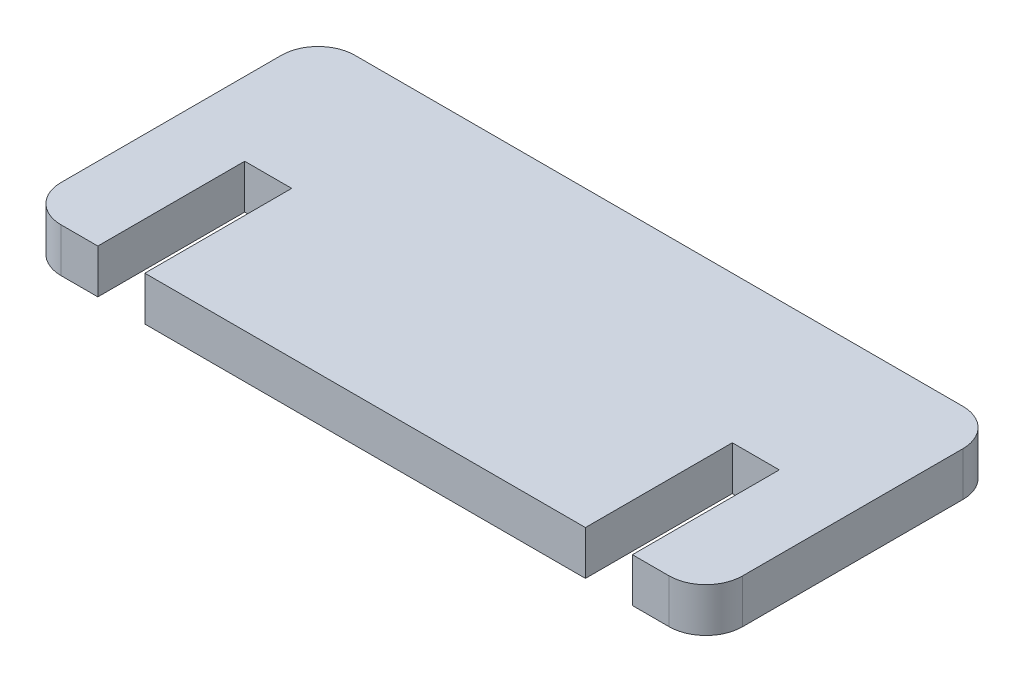
ISO-10303-21;
HEADER;
FILE_DESCRIPTION(('STEP AP214'),'2;1');
FILE_NAME('part.step','',(''),(''),'','','');
FILE_SCHEMA(('AUTOMOTIVE_DESIGN { 1 0 10303 214 1 1 1 1 }'));
ENDSEC;
DATA;
#1=APPLICATION_CONTEXT('core data for automotive mechanical design processes');
#2=APPLICATION_PROTOCOL_DEFINITION('international standard','automotive_design',2000,#1);
#3=PRODUCT_CONTEXT('',#1,'mechanical');
#4=PRODUCT('Part','Part','',(#3));
#5=PRODUCT_RELATED_PRODUCT_CATEGORY('part','',(#4));
#6=PRODUCT_DEFINITION_FORMATION('','',#4);
#7=PRODUCT_DEFINITION_CONTEXT('part definition',#1,'design');
#8=PRODUCT_DEFINITION('design','',#6,#7);
#9=PRODUCT_DEFINITION_SHAPE('','',#8);
#10=(LENGTH_UNIT() NAMED_UNIT(*) SI_UNIT(.MILLI.,.METRE.));
#11=(NAMED_UNIT(*) PLANE_ANGLE_UNIT() SI_UNIT($,.RADIAN.));
#12=(NAMED_UNIT(*) SI_UNIT($,.STERADIAN.) SOLID_ANGLE_UNIT());
#13=UNCERTAINTY_MEASURE_WITH_UNIT(LENGTH_MEASURE(1.E-05),#10,'distance_accuracy_value','');
#14=(GEOMETRIC_REPRESENTATION_CONTEXT(3) GLOBAL_UNCERTAINTY_ASSIGNED_CONTEXT((#13)) GLOBAL_UNIT_ASSIGNED_CONTEXT((#10,
#11,#12)) REPRESENTATION_CONTEXT('',''));
#15=CARTESIAN_POINT('',(0.,0.,0.));
#16=DIRECTION('',(0.,0.,1.));
#17=DIRECTION('',(1.,0.,0.));
#18=AXIS2_PLACEMENT_3D('',#15,#16,#17);
#19=CARTESIAN_POINT('',(15.,3.,0.));
#20=DIRECTION('',(-1.,0.,0.));
#21=DIRECTION('',(0.,0.,1.));
#22=AXIS2_PLACEMENT_3D('',#19,#20,#21);
#23=PLANE('',#22);
#24=DIRECTION('',(0.,0.,-1.));
#25=VECTOR('',#24,1.);
#26=CARTESIAN_POINT('',(15.,0.,0.));
#27=LINE('',#26,#25);
#28=CARTESIAN_POINT('',(15.,0.,10.));
#29=VERTEX_POINT('',#28);
#30=CARTESIAN_POINT('',(15.,0.,0.));
#31=VERTEX_POINT('',#30);
#32=EDGE_CURVE('E188',#29,#31,#27,.T.);
#33=ORIENTED_EDGE('',*,*,#32,.T.);
#34=DIRECTION('',(0.,-1.,0.));
#35=VECTOR('',#34,1.);
#36=CARTESIAN_POINT('',(15.,3.,0.));
#37=LINE('',#36,#35);
#38=CARTESIAN_POINT('',(15.,3.,0.));
#39=VERTEX_POINT('',#38);
#40=EDGE_CURVE('E11',#39,#31,#37,.T.);
#41=ORIENTED_EDGE('',*,*,#40,.F.);
#42=DIRECTION('',(0.,0.,-1.));
#43=VECTOR('',#42,1.);
#44=CARTESIAN_POINT('',(15.,3.,0.));
#45=LINE('',#44,#43);
#46=CARTESIAN_POINT('',(15.,3.,10.));
#47=VERTEX_POINT('',#46);
#48=EDGE_CURVE('E235',#47,#39,#45,.T.);
#49=ORIENTED_EDGE('',*,*,#48,.F.);
#50=DIRECTION('',(0.,-1.,0.));
#51=VECTOR('',#50,1.);
#52=CARTESIAN_POINT('',(15.,3.,10.));
#53=LINE('',#52,#51);
#54=EDGE_CURVE('E184',#47,#29,#53,.T.);
#55=ORIENTED_EDGE('',*,*,#54,.T.);
#56=EDGE_LOOP('',(#33,#41,#49,#55));
#57=FACE_BOUND('',#56,.T.);
#58=ADVANCED_FACE('F39',(#57),#23,.F.);
#59=CARTESIAN_POINT('',(18.2,3.,0.));
#60=DIRECTION('',(0.,0.,-1.));
#61=DIRECTION('',(-1.,0.,0.));
#62=AXIS2_PLACEMENT_3D('',#59,#60,#61);
#63=PLANE('',#62);
#64=DIRECTION('',(1.,0.,0.));
#65=VECTOR('',#64,1.);
#66=CARTESIAN_POINT('',(18.2,0.,0.));
#67=LINE('',#66,#65);
#68=CARTESIAN_POINT('',(18.2,0.,0.));
#69=VERTEX_POINT('',#68);
#70=EDGE_CURVE('E192',#31,#69,#67,.T.);
#71=ORIENTED_EDGE('',*,*,#70,.T.);
#72=DIRECTION('',(0.,-1.,0.));
#73=VECTOR('',#72,1.);
#74=CARTESIAN_POINT('',(18.2,3.,0.));
#75=LINE('',#74,#73);
#76=CARTESIAN_POINT('',(18.2,3.,0.));
#77=VERTEX_POINT('',#76);
#78=EDGE_CURVE('E48',#77,#69,#75,.T.);
#79=ORIENTED_EDGE('',*,*,#78,.F.);
#80=DIRECTION('',(1.,0.,0.));
#81=VECTOR('',#80,1.);
#82=CARTESIAN_POINT('',(18.2,3.,0.));
#83=LINE('',#82,#81);
#84=EDGE_CURVE('E123',#39,#77,#83,.T.);
#85=ORIENTED_EDGE('',*,*,#84,.F.);
#86=ORIENTED_EDGE('',*,*,#40,.T.);
#87=EDGE_LOOP('',(#71,#79,#85,#86));
#88=FACE_BOUND('',#87,.T.);
#89=ADVANCED_FACE('F357',(#88),#63,.F.);
#90=CARTESIAN_POINT('',(18.2,3.,10.));
#91=DIRECTION('',(1.,0.,0.));
#92=DIRECTION('',(0.,0.,-1.));
#93=AXIS2_PLACEMENT_3D('',#90,#91,#92);
#94=PLANE('',#93);
#95=DIRECTION('',(0.,0.,1.));
#96=VECTOR('',#95,1.);
#97=CARTESIAN_POINT('',(18.2,0.,10.));
#98=LINE('',#97,#96);
#99=CARTESIAN_POINT('',(18.2,0.,10.));
#100=VERTEX_POINT('',#99);
#101=EDGE_CURVE('E195',#69,#100,#98,.T.);
#102=ORIENTED_EDGE('',*,*,#101,.T.);
#103=DIRECTION('',(0.,-1.,0.));
#104=VECTOR('',#103,1.);
#105=CARTESIAN_POINT('',(18.2,3.,10.));
#106=LINE('',#105,#104);
#107=CARTESIAN_POINT('',(18.2,3.,10.));
#108=VERTEX_POINT('',#107);
#109=EDGE_CURVE('E278',#108,#100,#106,.T.);
#110=ORIENTED_EDGE('',*,*,#109,.F.);
#111=DIRECTION('',(0.,0.,1.));
#112=VECTOR('',#111,1.);
#113=CARTESIAN_POINT('',(18.2,3.,10.));
#114=LINE('',#113,#112);
#115=EDGE_CURVE('E288',#77,#108,#114,.T.);
#116=ORIENTED_EDGE('',*,*,#115,.F.);
#117=ORIENTED_EDGE('',*,*,#78,.T.);
#118=EDGE_LOOP('',(#102,#110,#116,#117));
#119=FACE_BOUND('',#118,.T.);
#120=ADVANCED_FACE('F286',(#119),#94,.F.);
#121=CARTESIAN_POINT('',(20.7,3.,10.));
#122=DIRECTION('',(0.,0.,-1.));
#123=DIRECTION('',(-1.,0.,0.));
#124=AXIS2_PLACEMENT_3D('',#121,#122,#123);
#125=PLANE('',#124);
#126=DIRECTION('',(1.,0.,0.));
#127=VECTOR('',#126,1.);
#128=CARTESIAN_POINT('',(20.7,0.,10.));
#129=LINE('',#128,#127);
#130=CARTESIAN_POINT('',(20.7,0.,10.));
#131=VERTEX_POINT('',#130);
#132=EDGE_CURVE('E198',#100,#131,#129,.T.);
#133=ORIENTED_EDGE('',*,*,#132,.T.);
#134=DIRECTION('',(0.,-1.,0.));
#135=VECTOR('',#134,1.);
#136=CARTESIAN_POINT('',(20.7,3.,10.));
#137=LINE('',#136,#135);
#138=CARTESIAN_POINT('',(20.7,3.,10.));
#139=VERTEX_POINT('',#138);
#140=EDGE_CURVE('E274',#139,#131,#137,.T.);
#141=ORIENTED_EDGE('',*,*,#140,.F.);
#142=DIRECTION('',(1.,0.,0.));
#143=VECTOR('',#142,1.);
#144=CARTESIAN_POINT('',(20.7,3.,10.));
#145=LINE('',#144,#143);
#146=EDGE_CURVE('E307',#108,#139,#145,.T.);
#147=ORIENTED_EDGE('',*,*,#146,.F.);
#148=ORIENTED_EDGE('',*,*,#109,.T.);
#149=EDGE_LOOP('',(#133,#141,#147,#148));
#150=FACE_BOUND('',#149,.T.);
#151=ADVANCED_FACE('F297',(#150),#125,.F.);
#152=CARTESIAN_POINT('',(20.7,3.,7.5));
#153=DIRECTION('',(0.,-1.,0.));
#154=DIRECTION('',(0.,0.,-1.));
#155=AXIS2_PLACEMENT_3D('',#152,#153,#154);
#156=CYLINDRICAL_SURFACE('',#155,2.5);
#157=CARTESIAN_POINT('',(20.7,0.,7.5));
#158=DIRECTION('',(0.,1.,0.));
#159=DIRECTION('',(0.,0.,-1.));
#160=AXIS2_PLACEMENT_3D('',#157,#158,#159);
#161=CIRCLE('',#160,2.5);
#162=CARTESIAN_POINT('',(23.2,0.,7.5));
#163=VERTEX_POINT('',#162);
#164=EDGE_CURVE('E201',#131,#163,#161,.T.);
#165=ORIENTED_EDGE('',*,*,#164,.T.);
#166=DIRECTION('',(0.,-1.,0.));
#167=VECTOR('',#166,1.);
#168=CARTESIAN_POINT('',(23.2,3.,7.5));
#169=LINE('',#168,#167);
#170=CARTESIAN_POINT('',(23.2,3.,7.5));
#171=VERTEX_POINT('',#170);
#172=EDGE_CURVE('E270',#171,#163,#169,.T.);
#173=ORIENTED_EDGE('',*,*,#172,.F.);
#174=CARTESIAN_POINT('',(20.7,3.,7.5));
#175=DIRECTION('',(0.,1.,0.));
#176=DIRECTION('',(0.,0.,-1.));
#177=AXIS2_PLACEMENT_3D('',#174,#175,#176);
#178=CIRCLE('',#177,2.5);
#179=EDGE_CURVE('E303',#139,#171,#178,.T.);
#180=ORIENTED_EDGE('',*,*,#179,.F.);
#181=ORIENTED_EDGE('',*,*,#140,.T.);
#182=EDGE_LOOP('',(#165,#173,#180,#181));
#183=FACE_BOUND('',#182,.T.);
#184=ADVANCED_FACE('F301',(#183),#156,.T.);
#185=CARTESIAN_POINT('',(23.2,3.,-7.5));
#186=DIRECTION('',(-1.,0.,0.));
#187=DIRECTION('',(0.,0.,1.));
#188=AXIS2_PLACEMENT_3D('',#185,#186,#187);
#189=PLANE('',#188);
#190=DIRECTION('',(0.,0.,-1.));
#191=VECTOR('',#190,1.);
#192=CARTESIAN_POINT('',(23.2,0.,-7.5));
#193=LINE('',#192,#191);
#194=CARTESIAN_POINT('',(23.2,0.,-7.5));
#195=VERTEX_POINT('',#194);
#196=EDGE_CURVE('E204',#163,#195,#193,.T.);
#197=ORIENTED_EDGE('',*,*,#196,.T.);
#198=DIRECTION('',(0.,-1.,0.));
#199=VECTOR('',#198,1.);
#200=CARTESIAN_POINT('',(23.2,3.,-7.5));
#201=LINE('',#200,#199);
#202=CARTESIAN_POINT('',(23.2,3.,-7.5));
#203=VERTEX_POINT('',#202);
#204=EDGE_CURVE('E266',#203,#195,#201,.T.);
#205=ORIENTED_EDGE('',*,*,#204,.F.);
#206=DIRECTION('',(0.,0.,-1.));
#207=VECTOR('',#206,1.);
#208=CARTESIAN_POINT('',(23.2,3.,-7.5));
#209=LINE('',#208,#207);
#210=EDGE_CURVE('E306',#171,#203,#209,.T.);
#211=ORIENTED_EDGE('',*,*,#210,.F.);
#212=ORIENTED_EDGE('',*,*,#172,.T.);
#213=EDGE_LOOP('',(#197,#205,#211,#212));
#214=FACE_BOUND('',#213,.T.);
#215=ADVANCED_FACE('F370',(#214),#189,.F.);
#216=CARTESIAN_POINT('',(20.7,3.,-7.5));
#217=DIRECTION('',(0.,-1.,0.));
#218=DIRECTION('',(0.,0.,-1.));
#219=AXIS2_PLACEMENT_3D('',#216,#217,#218);
#220=CYLINDRICAL_SURFACE('',#219,2.5);
#221=CARTESIAN_POINT('',(20.7,0.,-7.5));
#222=DIRECTION('',(0.,1.,0.));
#223=DIRECTION('',(0.,0.,-1.));
#224=AXIS2_PLACEMENT_3D('',#221,#222,#223);
#225=CIRCLE('',#224,2.5);
#226=CARTESIAN_POINT('',(20.7,0.,-10.));
#227=VERTEX_POINT('',#226);
#228=EDGE_CURVE('E207',#195,#227,#225,.T.);
#229=ORIENTED_EDGE('',*,*,#228,.T.);
#230=DIRECTION('',(0.,-1.,0.));
#231=VECTOR('',#230,1.);
#232=CARTESIAN_POINT('',(20.7,3.,-10.));
#233=LINE('',#232,#231);
#234=CARTESIAN_POINT('',(20.7,3.,-10.));
#235=VERTEX_POINT('',#234);
#236=EDGE_CURVE('E262',#235,#227,#233,.T.);
#237=ORIENTED_EDGE('',*,*,#236,.F.);
#238=CARTESIAN_POINT('',(20.7,3.,-7.5));
#239=DIRECTION('',(0.,1.,0.));
#240=DIRECTION('',(0.,0.,-1.));
#241=AXIS2_PLACEMENT_3D('',#238,#239,#240);
#242=CIRCLE('',#241,2.5);
#243=EDGE_CURVE('E311',#203,#235,#242,.T.);
#244=ORIENTED_EDGE('',*,*,#243,.F.);
#245=ORIENTED_EDGE('',*,*,#204,.T.);
#246=EDGE_LOOP('',(#229,#237,#244,#245));
#247=FACE_BOUND('',#246,.T.);
#248=ADVANCED_FACE('F373',(#247),#220,.T.);
#249=CARTESIAN_POINT('',(-15.,3.,-10.));
#250=DIRECTION('',(0.,0.,1.));
#251=DIRECTION('',(1.,0.,0.));
#252=AXIS2_PLACEMENT_3D('',#249,#250,#251);
#253=PLANE('',#252);
#254=DIRECTION('',(-1.,0.,0.));
#255=VECTOR('',#254,1.);
#256=CARTESIAN_POINT('',(-15.,0.,-10.));
#257=LINE('',#256,#255);
#258=CARTESIAN_POINT('',(-20.7,0.,-10.));
#259=VERTEX_POINT('',#258);
#260=EDGE_CURVE('E211',#227,#259,#257,.T.);
#261=ORIENTED_EDGE('',*,*,#260,.T.);
#262=DIRECTION('',(0.,-1.,0.));
#263=VECTOR('',#262,1.);
#264=CARTESIAN_POINT('',(-20.7,3.,-10.));
#265=LINE('',#264,#263);
#266=CARTESIAN_POINT('',(-20.7,3.,-10.));
#267=VERTEX_POINT('',#266);
#268=EDGE_CURVE('E258',#267,#259,#265,.T.);
#269=ORIENTED_EDGE('',*,*,#268,.F.);
#270=DIRECTION('',(-1.,0.,0.));
#271=VECTOR('',#270,1.);
#272=CARTESIAN_POINT('',(15.,3.,-10.));
#273=LINE('',#272,#271);
#274=EDGE_CURVE('E318',#235,#267,#273,.T.);
#275=ORIENTED_EDGE('',*,*,#274,.F.);
#276=ORIENTED_EDGE('',*,*,#236,.T.);
#277=EDGE_LOOP('',(#261,#269,#275,#276));
#278=FACE_BOUND('',#277,.T.);
#279=ADVANCED_FACE('F377',(#278),#253,.F.);
#280=CARTESIAN_POINT('',(-20.7,3.,-7.5));
#281=DIRECTION('',(0.,-1.,0.));
#282=DIRECTION('',(0.,0.,-1.));
#283=AXIS2_PLACEMENT_3D('',#280,#281,#282);
#284=CYLINDRICAL_SURFACE('',#283,2.5);
#285=CARTESIAN_POINT('',(-20.7,0.,-7.5));
#286=DIRECTION('',(0.,1.,0.));
#287=DIRECTION('',(0.,0.,1.));
#288=AXIS2_PLACEMENT_3D('',#285,#286,#287);
#289=CIRCLE('',#288,2.5);
#290=CARTESIAN_POINT('',(-23.2,0.,-7.5));
#291=VERTEX_POINT('',#290);
#292=EDGE_CURVE('E214',#259,#291,#289,.T.);
#293=ORIENTED_EDGE('',*,*,#292,.T.);
#294=DIRECTION('',(0.,-1.,0.));
#295=VECTOR('',#294,1.);
#296=CARTESIAN_POINT('',(-23.2,3.,-7.5));
#297=LINE('',#296,#295);
#298=CARTESIAN_POINT('',(-23.2,3.,-7.5));
#299=VERTEX_POINT('',#298);
#300=EDGE_CURVE('E254',#299,#291,#297,.T.);
#301=ORIENTED_EDGE('',*,*,#300,.F.);
#302=CARTESIAN_POINT('',(-20.7,3.,-7.5));
#303=DIRECTION('',(0.,1.,0.));
#304=DIRECTION('',(0.,0.,1.));
#305=AXIS2_PLACEMENT_3D('',#302,#303,#304);
#306=CIRCLE('',#305,2.5);
#307=EDGE_CURVE('E321',#267,#299,#306,.T.);
#308=ORIENTED_EDGE('',*,*,#307,.F.);
#309=ORIENTED_EDGE('',*,*,#268,.T.);
#310=EDGE_LOOP('',(#293,#301,#308,#309));
#311=FACE_BOUND('',#310,.T.);
#312=ADVANCED_FACE('F381',(#311),#284,.T.);
#313=CARTESIAN_POINT('',(-23.2,3.,-7.5));
#314=DIRECTION('',(1.,0.,0.));
#315=DIRECTION('',(0.,0.,-1.));
#316=AXIS2_PLACEMENT_3D('',#313,#314,#315);
#317=PLANE('',#316);
#318=DIRECTION('',(0.,0.,1.));
#319=VECTOR('',#318,1.);
#320=CARTESIAN_POINT('',(-23.2,0.,-7.5));
#321=LINE('',#320,#319);
#322=CARTESIAN_POINT('',(-23.2,0.,7.5));
#323=VERTEX_POINT('',#322);
#324=EDGE_CURVE('E217',#291,#323,#321,.T.);
#325=ORIENTED_EDGE('',*,*,#324,.T.);
#326=DIRECTION('',(0.,-1.,0.));
#327=VECTOR('',#326,1.);
#328=CARTESIAN_POINT('',(-23.2,3.,7.5));
#329=LINE('',#328,#327);
#330=CARTESIAN_POINT('',(-23.2,3.,7.5));
#331=VERTEX_POINT('',#330);
#332=EDGE_CURVE('E250',#331,#323,#329,.T.);
#333=ORIENTED_EDGE('',*,*,#332,.F.);
#334=DIRECTION('',(0.,0.,1.));
#335=VECTOR('',#334,1.);
#336=CARTESIAN_POINT('',(-23.2,3.,-7.5));
#337=LINE('',#336,#335);
#338=EDGE_CURVE('E324',#299,#331,#337,.T.);
#339=ORIENTED_EDGE('',*,*,#338,.F.);
#340=ORIENTED_EDGE('',*,*,#300,.T.);
#341=EDGE_LOOP('',(#325,#333,#339,#340));
#342=FACE_BOUND('',#341,.T.);
#343=ADVANCED_FACE('F385',(#342),#317,.F.);
#344=CARTESIAN_POINT('',(-20.7,3.,7.5));
#345=DIRECTION('',(0.,-1.,0.));
#346=DIRECTION('',(0.,0.,-1.));
#347=AXIS2_PLACEMENT_3D('',#344,#345,#346);
#348=CYLINDRICAL_SURFACE('',#347,2.5);
#349=CARTESIAN_POINT('',(-20.7,0.,7.5));
#350=DIRECTION('',(0.,1.,0.));
#351=DIRECTION('',(0.,0.,1.));
#352=AXIS2_PLACEMENT_3D('',#349,#350,#351);
#353=CIRCLE('',#352,2.5);
#354=CARTESIAN_POINT('',(-20.7,0.,10.));
#355=VERTEX_POINT('',#354);
#356=EDGE_CURVE('E220',#323,#355,#353,.T.);
#357=ORIENTED_EDGE('',*,*,#356,.T.);
#358=DIRECTION('',(0.,-1.,0.));
#359=VECTOR('',#358,1.);
#360=CARTESIAN_POINT('',(-20.7,3.,10.));
#361=LINE('',#360,#359);
#362=CARTESIAN_POINT('',(-20.7,3.,10.));
#363=VERTEX_POINT('',#362);
#364=EDGE_CURVE('E246',#363,#355,#361,.T.);
#365=ORIENTED_EDGE('',*,*,#364,.F.);
#366=CARTESIAN_POINT('',(-20.7,3.,7.5));
#367=DIRECTION('',(0.,1.,0.));
#368=DIRECTION('',(0.,0.,1.));
#369=AXIS2_PLACEMENT_3D('',#366,#367,#368);
#370=CIRCLE('',#369,2.5);
#371=EDGE_CURVE('E327',#331,#363,#370,.T.);
#372=ORIENTED_EDGE('',*,*,#371,.F.);
#373=ORIENTED_EDGE('',*,*,#332,.T.);
#374=EDGE_LOOP('',(#357,#365,#372,#373));
#375=FACE_BOUND('',#374,.T.);
#376=ADVANCED_FACE('F389',(#375),#348,.T.);
#377=CARTESIAN_POINT('',(-20.7,3.,10.));
#378=DIRECTION('',(0.,0.,-1.));
#379=DIRECTION('',(-1.,0.,0.));
#380=AXIS2_PLACEMENT_3D('',#377,#378,#379);
#381=PLANE('',#380);
#382=DIRECTION('',(1.,0.,0.));
#383=VECTOR('',#382,1.);
#384=CARTESIAN_POINT('',(-20.7,0.,10.));
#385=LINE('',#384,#383);
#386=CARTESIAN_POINT('',(-18.2,0.,10.));
#387=VERTEX_POINT('',#386);
#388=EDGE_CURVE('E223',#355,#387,#385,.T.);
#389=ORIENTED_EDGE('',*,*,#388,.T.);
#390=DIRECTION('',(0.,-1.,0.));
#391=VECTOR('',#390,1.);
#392=CARTESIAN_POINT('',(-18.2,3.,10.));
#393=LINE('',#392,#391);
#394=CARTESIAN_POINT('',(-18.2,3.,10.));
#395=VERTEX_POINT('',#394);
#396=EDGE_CURVE('E242',#395,#387,#393,.T.);
#397=ORIENTED_EDGE('',*,*,#396,.F.);
#398=DIRECTION('',(1.,0.,0.));
#399=VECTOR('',#398,1.);
#400=CARTESIAN_POINT('',(-20.7,3.,10.));
#401=LINE('',#400,#399);
#402=EDGE_CURVE('E330',#363,#395,#401,.T.);
#403=ORIENTED_EDGE('',*,*,#402,.F.);
#404=ORIENTED_EDGE('',*,*,#364,.T.);
#405=EDGE_LOOP('',(#389,#397,#403,#404));
#406=FACE_BOUND('',#405,.T.);
#407=ADVANCED_FACE('F338',(#406),#381,.F.);
#408=CARTESIAN_POINT('',(-18.2,3.,10.));
#409=DIRECTION('',(-1.,0.,0.));
#410=DIRECTION('',(0.,0.,1.));
#411=AXIS2_PLACEMENT_3D('',#408,#409,#410);
#412=PLANE('',#411);
#413=DIRECTION('',(0.,0.,-1.));
#414=VECTOR('',#413,1.);
#415=CARTESIAN_POINT('',(-18.2,0.,10.));
#416=LINE('',#415,#414);
#417=CARTESIAN_POINT('',(-18.2,0.,0.));
#418=VERTEX_POINT('',#417);
#419=EDGE_CURVE('E226',#387,#418,#416,.T.);
#420=ORIENTED_EDGE('',*,*,#419,.T.);
#421=DIRECTION('',(0.,-1.,0.));
#422=VECTOR('',#421,1.);
#423=CARTESIAN_POINT('',(-18.2,3.,0.));
#424=LINE('',#423,#422);
#425=CARTESIAN_POINT('',(-18.2,3.,0.));
#426=VERTEX_POINT('',#425);
#427=EDGE_CURVE('E177',#426,#418,#424,.T.);
#428=ORIENTED_EDGE('',*,*,#427,.F.);
#429=DIRECTION('',(0.,0.,-1.));
#430=VECTOR('',#429,1.);
#431=CARTESIAN_POINT('',(-18.2,3.,10.));
#432=LINE('',#431,#430);
#433=EDGE_CURVE('E166',#395,#426,#432,.T.);
#434=ORIENTED_EDGE('',*,*,#433,.F.);
#435=ORIENTED_EDGE('',*,*,#396,.T.);
#436=EDGE_LOOP('',(#420,#428,#434,#435));
#437=FACE_BOUND('',#436,.T.);
#438=ADVANCED_FACE('F342',(#437),#412,.F.);
#439=CARTESIAN_POINT('',(-18.2,3.,0.));
#440=DIRECTION('',(0.,0.,-1.));
#441=DIRECTION('',(-1.,0.,0.));
#442=AXIS2_PLACEMENT_3D('',#439,#440,#441);
#443=PLANE('',#442);
#444=DIRECTION('',(1.,0.,0.));
#445=VECTOR('',#444,1.);
#446=CARTESIAN_POINT('',(-18.2,0.,0.));
#447=LINE('',#446,#445);
#448=CARTESIAN_POINT('',(-15.,0.,0.));
#449=VERTEX_POINT('',#448);
#450=EDGE_CURVE('E175',#418,#449,#447,.T.);
#451=ORIENTED_EDGE('',*,*,#450,.T.);
#452=DIRECTION('',(0.,-1.,0.));
#453=VECTOR('',#452,1.);
#454=CARTESIAN_POINT('',(-15.,3.,0.));
#455=LINE('',#454,#453);
#456=CARTESIAN_POINT('',(-15.,3.,0.));
#457=VERTEX_POINT('',#456);
#458=EDGE_CURVE('E172',#457,#449,#455,.T.);
#459=ORIENTED_EDGE('',*,*,#458,.F.);
#460=DIRECTION('',(1.,0.,0.));
#461=VECTOR('',#460,1.);
#462=CARTESIAN_POINT('',(-18.2,3.,0.));
#463=LINE('',#462,#461);
#464=EDGE_CURVE('E160',#426,#457,#463,.T.);
#465=ORIENTED_EDGE('',*,*,#464,.F.);
#466=ORIENTED_EDGE('',*,*,#427,.T.);
#467=EDGE_LOOP('',(#451,#459,#465,#466));
#468=FACE_BOUND('',#467,.T.);
#469=ADVANCED_FACE('F173',(#468),#443,.F.);
#470=CARTESIAN_POINT('',(-15.,3.,0.));
#471=DIRECTION('',(1.,0.,0.));
#472=DIRECTION('',(0.,0.,-1.));
#473=AXIS2_PLACEMENT_3D('',#470,#471,#472);
#474=PLANE('',#473);
#475=DIRECTION('',(0.,0.,1.));
#476=VECTOR('',#475,1.);
#477=CARTESIAN_POINT('',(-15.,0.,0.));
#478=LINE('',#477,#476);
#479=CARTESIAN_POINT('',(-15.,0.,10.));
#480=VERTEX_POINT('',#479);
#481=EDGE_CURVE('E109',#449,#480,#478,.T.);
#482=ORIENTED_EDGE('',*,*,#481,.T.);
#483=DIRECTION('',(0.,-1.,0.));
#484=VECTOR('',#483,1.);
#485=CARTESIAN_POINT('',(-15.,3.,10.));
#486=LINE('',#485,#484);
#487=CARTESIAN_POINT('',(-15.,3.,10.));
#488=VERTEX_POINT('',#487);
#489=EDGE_CURVE('E178',#488,#480,#486,.T.);
#490=ORIENTED_EDGE('',*,*,#489,.F.);
#491=DIRECTION('',(0.,0.,1.));
#492=VECTOR('',#491,1.);
#493=CARTESIAN_POINT('',(-15.,3.,0.));
#494=LINE('',#493,#492);
#495=EDGE_CURVE('E164',#457,#488,#494,.T.);
#496=ORIENTED_EDGE('',*,*,#495,.F.);
#497=ORIENTED_EDGE('',*,*,#458,.T.);
#498=EDGE_LOOP('',(#482,#490,#496,#497));
#499=FACE_BOUND('',#498,.T.);
#500=ADVANCED_FACE('F180',(#499),#474,.F.);
#501=CARTESIAN_POINT('',(-15.,3.,10.));
#502=DIRECTION('',(0.,0.,-1.));
#503=DIRECTION('',(-1.,0.,0.));
#504=AXIS2_PLACEMENT_3D('',#501,#502,#503);
#505=PLANE('',#504);
#506=DIRECTION('',(1.,0.,0.));
#507=VECTOR('',#506,1.);
#508=CARTESIAN_POINT('',(-15.,0.,10.));
#509=LINE('',#508,#507);
#510=EDGE_CURVE('E115',#480,#29,#509,.T.);
#511=ORIENTED_EDGE('',*,*,#510,.T.);
#512=ORIENTED_EDGE('',*,*,#54,.F.);
#513=DIRECTION('',(1.,0.,0.));
#514=VECTOR('',#513,1.);
#515=CARTESIAN_POINT('',(-15.,3.,10.));
#516=LINE('',#515,#514);
#517=EDGE_CURVE('E56',#488,#47,#516,.T.);
#518=ORIENTED_EDGE('',*,*,#517,.F.);
#519=ORIENTED_EDGE('',*,*,#489,.T.);
#520=EDGE_LOOP('',(#511,#512,#518,#519));
#521=FACE_BOUND('',#520,.T.);
#522=ADVANCED_FACE('F346',(#521),#505,.F.);
#523=CARTESIAN_POINT('',(-20.7,3.,7.5));
#524=DIRECTION('',(0.,1.,0.));
#525=DIRECTION('',(0.,0.,1.));
#526=AXIS2_PLACEMENT_3D('',#523,#524,#525);
#527=PLANE('',#526);
#528=ORIENTED_EDGE('',*,*,#48,.T.);
#529=ORIENTED_EDGE('',*,*,#84,.T.);
#530=ORIENTED_EDGE('',*,*,#115,.T.);
#531=ORIENTED_EDGE('',*,*,#146,.T.);
#532=ORIENTED_EDGE('',*,*,#179,.T.);
#533=ORIENTED_EDGE('',*,*,#210,.T.);
#534=ORIENTED_EDGE('',*,*,#243,.T.);
#535=ORIENTED_EDGE('',*,*,#274,.T.);
#536=ORIENTED_EDGE('',*,*,#307,.T.);
#537=ORIENTED_EDGE('',*,*,#338,.T.);
#538=ORIENTED_EDGE('',*,*,#371,.T.);
#539=ORIENTED_EDGE('',*,*,#402,.T.);
#540=ORIENTED_EDGE('',*,*,#433,.T.);
#541=ORIENTED_EDGE('',*,*,#464,.T.);
#542=ORIENTED_EDGE('',*,*,#495,.T.);
#543=ORIENTED_EDGE('',*,*,#517,.T.);
#544=EDGE_LOOP('',(#528,#529,#530,#531,#532,#533,#534,#535,#536,#537,#538,#539,#540,#541,#542,#543));
#545=FACE_BOUND('',#544,.T.);
#546=ADVANCED_FACE('F162',(#545),#527,.T.);
#547=CARTESIAN_POINT('',(-20.7,0.,7.5));
#548=DIRECTION('',(0.,1.,0.));
#549=DIRECTION('',(0.,0.,1.));
#550=AXIS2_PLACEMENT_3D('',#547,#548,#549);
#551=PLANE('',#550);
#552=ORIENTED_EDGE('',*,*,#32,.F.);
#553=ORIENTED_EDGE('',*,*,#510,.F.);
#554=ORIENTED_EDGE('',*,*,#481,.F.);
#555=ORIENTED_EDGE('',*,*,#450,.F.);
#556=ORIENTED_EDGE('',*,*,#419,.F.);
#557=ORIENTED_EDGE('',*,*,#388,.F.);
#558=ORIENTED_EDGE('',*,*,#356,.F.);
#559=ORIENTED_EDGE('',*,*,#324,.F.);
#560=ORIENTED_EDGE('',*,*,#292,.F.);
#561=ORIENTED_EDGE('',*,*,#260,.F.);
#562=ORIENTED_EDGE('',*,*,#228,.F.);
#563=ORIENTED_EDGE('',*,*,#196,.F.);
#564=ORIENTED_EDGE('',*,*,#164,.F.);
#565=ORIENTED_EDGE('',*,*,#132,.F.);
#566=ORIENTED_EDGE('',*,*,#101,.F.);
#567=ORIENTED_EDGE('',*,*,#70,.F.);
#568=EDGE_LOOP('',(#552,#553,#554,#555,#556,#557,#558,#559,#560,#561,#562,#563,#564,#565,#566,#567));
#569=FACE_BOUND('',#568,.T.);
#570=ADVANCED_FACE('F292',(#569),#551,.F.);
#571=CLOSED_SHELL('',(#58,#89,#120,#151,#184,#215,#248,#279,#312,#343,#376,#407,#438,#469,#500,
#522,#546,#570));
#572=MANIFOLD_SOLID_BREP('B2',#571);
#573=ADVANCED_BREP_SHAPE_REPRESENTATION('',(#18,#572),#14);
#574=SHAPE_DEFINITION_REPRESENTATION(#9,#573);
ENDSEC;
END-ISO-10303-21;
